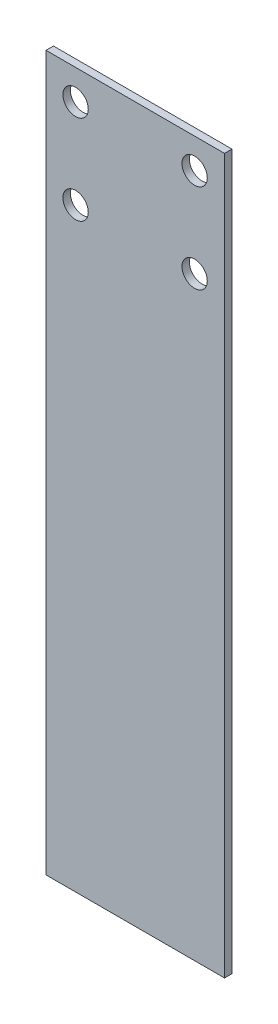
ISO-10303-21;
HEADER;
FILE_DESCRIPTION(('STEP AP214'),'2;1');
FILE_NAME('part.step','',(''),(''),'','','');
FILE_SCHEMA(('AUTOMOTIVE_DESIGN { 1 0 10303 214 1 1 1 1 }'));
ENDSEC;
DATA;
#1=APPLICATION_CONTEXT('core data for automotive mechanical design processes');
#2=APPLICATION_PROTOCOL_DEFINITION('international standard','automotive_design',2000,#1);
#3=PRODUCT_CONTEXT('',#1,'mechanical');
#4=PRODUCT('Part','Part','',(#3));
#5=PRODUCT_RELATED_PRODUCT_CATEGORY('part','',(#4));
#6=PRODUCT_DEFINITION_FORMATION('','',#4);
#7=PRODUCT_DEFINITION_CONTEXT('part definition',#1,'design');
#8=PRODUCT_DEFINITION('design','',#6,#7);
#9=PRODUCT_DEFINITION_SHAPE('','',#8);
#10=(LENGTH_UNIT() NAMED_UNIT(*) SI_UNIT(.MILLI.,.METRE.));
#11=(NAMED_UNIT(*) PLANE_ANGLE_UNIT() SI_UNIT($,.RADIAN.));
#12=(NAMED_UNIT(*) SI_UNIT($,.STERADIAN.) SOLID_ANGLE_UNIT());
#13=UNCERTAINTY_MEASURE_WITH_UNIT(LENGTH_MEASURE(1.E-05),#10,'distance_accuracy_value','');
#14=(GEOMETRIC_REPRESENTATION_CONTEXT(3) GLOBAL_UNCERTAINTY_ASSIGNED_CONTEXT((#13)) GLOBAL_UNIT_ASSIGNED_CONTEXT((#10,
#11,#12)) REPRESENTATION_CONTEXT('',''));
#15=CARTESIAN_POINT('',(0.,0.,0.));
#16=DIRECTION('',(0.,0.,1.));
#17=DIRECTION('',(1.,0.,0.));
#18=AXIS2_PLACEMENT_3D('',#15,#16,#17);
#19=CARTESIAN_POINT('',(-74.4140625,73.52109375,3.175));
#20=DIRECTION('',(1.,0.,0.));
#21=DIRECTION('',(0.,1.,0.));
#22=AXIS2_PLACEMENT_3D('',#19,#20,#21);
#23=PLANE('',#22);
#24=DIRECTION('',(0.,-1.,0.));
#25=VECTOR('',#24,1.);
#26=CARTESIAN_POINT('',(-74.4140625,73.52109375,0.));
#27=LINE('',#26,#25);
#28=CARTESIAN_POINT('',(-74.4140625,73.52109375,0.));
#29=VERTEX_POINT('',#28);
#30=CARTESIAN_POINT('',(-74.4140624999999,-231.27890625,0.));
#31=VERTEX_POINT('',#30);
#32=EDGE_CURVE('E107',#29,#31,#27,.T.);
#33=ORIENTED_EDGE('',*,*,#32,.T.);
#34=DIRECTION('',(0.,0.,-1.));
#35=VECTOR('',#34,1.);
#36=CARTESIAN_POINT('',(-74.4140624999999,-231.27890625,3.175));
#37=LINE('',#36,#35);
#38=CARTESIAN_POINT('',(-74.4140624999999,-231.27890625,3.175));
#39=VERTEX_POINT('',#38);
#40=EDGE_CURVE('E11',#39,#31,#37,.T.);
#41=ORIENTED_EDGE('',*,*,#40,.F.);
#42=DIRECTION('',(0.,-1.,0.));
#43=VECTOR('',#42,1.);
#44=CARTESIAN_POINT('',(-74.4140625,73.52109375,3.175));
#45=LINE('',#44,#43);
#46=CARTESIAN_POINT('',(-74.4140625,73.52109375,3.175));
#47=VERTEX_POINT('',#46);
#48=EDGE_CURVE('E91',#47,#39,#45,.T.);
#49=ORIENTED_EDGE('',*,*,#48,.F.);
#50=DIRECTION('',(0.,0.,-1.));
#51=VECTOR('',#50,1.);
#52=CARTESIAN_POINT('',(-74.4140625,73.52109375,3.175));
#53=LINE('',#52,#51);
#54=EDGE_CURVE('E103',#47,#29,#53,.T.);
#55=ORIENTED_EDGE('',*,*,#54,.T.);
#56=EDGE_LOOP('',(#33,#41,#49,#55));
#57=FACE_BOUND('',#56,.T.);
#58=ADVANCED_FACE('F39',(#57),#23,.F.);
#59=CARTESIAN_POINT('',(-74.4140624999999,-231.27890625,3.175));
#60=DIRECTION('',(0.,1.,0.));
#61=DIRECTION('',(0.,0.,1.));
#62=AXIS2_PLACEMENT_3D('',#59,#60,#61);
#63=PLANE('',#62);
#64=DIRECTION('',(1.,0.,0.));
#65=VECTOR('',#64,1.);
#66=CARTESIAN_POINT('',(-74.4140624999999,-231.27890625,0.));
#67=LINE('',#66,#65);
#68=CARTESIAN_POINT('',(1.78593750000004,-231.27890625,0.));
#69=VERTEX_POINT('',#68);
#70=EDGE_CURVE('E96',#31,#69,#67,.T.);
#71=ORIENTED_EDGE('',*,*,#70,.T.);
#72=DIRECTION('',(0.,0.,-1.));
#73=VECTOR('',#72,1.);
#74=CARTESIAN_POINT('',(1.78593750000004,-231.27890625,3.175));
#75=LINE('',#74,#73);
#76=CARTESIAN_POINT('',(1.78593750000004,-231.27890625,3.175));
#77=VERTEX_POINT('',#76);
#78=EDGE_CURVE('E48',#77,#69,#75,.T.);
#79=ORIENTED_EDGE('',*,*,#78,.F.);
#80=DIRECTION('',(1.,0.,0.));
#81=VECTOR('',#80,1.);
#82=CARTESIAN_POINT('',(-74.4140624999999,-231.27890625,3.175));
#83=LINE('',#82,#81);
#84=EDGE_CURVE('E86',#39,#77,#83,.T.);
#85=ORIENTED_EDGE('',*,*,#84,.F.);
#86=ORIENTED_EDGE('',*,*,#40,.T.);
#87=EDGE_LOOP('',(#71,#79,#85,#86));
#88=FACE_BOUND('',#87,.T.);
#89=ADVANCED_FACE('F95',(#88),#63,.F.);
#90=CARTESIAN_POINT('',(1.7859375,73.52109375,3.175));
#91=DIRECTION('',(-1.,0.,0.));
#92=DIRECTION('',(0.,-1.,0.));
#93=AXIS2_PLACEMENT_3D('',#90,#91,#92);
#94=PLANE('',#93);
#95=DIRECTION('',(0.,1.,0.));
#96=VECTOR('',#95,1.);
#97=CARTESIAN_POINT('',(1.7859375,73.52109375,0.));
#98=LINE('',#97,#96);
#99=CARTESIAN_POINT('',(1.7859375,73.52109375,0.));
#100=VERTEX_POINT('',#99);
#101=EDGE_CURVE('E73',#69,#100,#98,.T.);
#102=ORIENTED_EDGE('',*,*,#101,.T.);
#103=DIRECTION('',(0.,0.,-1.));
#104=VECTOR('',#103,1.);
#105=CARTESIAN_POINT('',(1.7859375,73.52109375,3.175));
#106=LINE('',#105,#104);
#107=CARTESIAN_POINT('',(1.7859375,73.52109375,3.175));
#108=VERTEX_POINT('',#107);
#109=EDGE_CURVE('E98',#108,#100,#106,.T.);
#110=ORIENTED_EDGE('',*,*,#109,.F.);
#111=DIRECTION('',(0.,1.,0.));
#112=VECTOR('',#111,1.);
#113=CARTESIAN_POINT('',(1.7859375,73.52109375,3.175));
#114=LINE('',#113,#112);
#115=EDGE_CURVE('E89',#77,#108,#114,.T.);
#116=ORIENTED_EDGE('',*,*,#115,.F.);
#117=ORIENTED_EDGE('',*,*,#78,.T.);
#118=EDGE_LOOP('',(#102,#110,#116,#117));
#119=FACE_BOUND('',#118,.T.);
#120=ADVANCED_FACE('F99',(#119),#94,.F.);
#121=CARTESIAN_POINT('',(-74.4140625,73.52109375,3.175));
#122=DIRECTION('',(0.,-1.,0.));
#123=DIRECTION('',(0.,0.,-1.));
#124=AXIS2_PLACEMENT_3D('',#121,#122,#123);
#125=PLANE('',#124);
#126=DIRECTION('',(-1.,0.,0.));
#127=VECTOR('',#126,1.);
#128=CARTESIAN_POINT('',(-74.4140625,73.52109375,0.));
#129=LINE('',#128,#127);
#130=EDGE_CURVE('E79',#100,#29,#129,.T.);
#131=ORIENTED_EDGE('',*,*,#130,.T.);
#132=ORIENTED_EDGE('',*,*,#54,.F.);
#133=DIRECTION('',(-1.,0.,0.));
#134=VECTOR('',#133,1.);
#135=CARTESIAN_POINT('',(-74.4140625,73.52109375,3.175));
#136=LINE('',#135,#134);
#137=EDGE_CURVE('E56',#108,#47,#136,.T.);
#138=ORIENTED_EDGE('',*,*,#137,.F.);
#139=ORIENTED_EDGE('',*,*,#109,.T.);
#140=EDGE_LOOP('',(#131,#132,#138,#139));
#141=FACE_BOUND('',#140,.T.);
#142=ADVANCED_FACE('F121',(#141),#125,.F.);
#143=CARTESIAN_POINT('',(0.,0.,3.175));
#144=DIRECTION('',(0.,0.,1.));
#145=DIRECTION('',(1.,0.,0.));
#146=AXIS2_PLACEMENT_3D('',#143,#144,#145);
#147=PLANE('',#146);
#148=CARTESIAN_POINT('',(-10.990440278763,60.7417293205692,3.175));
#149=DIRECTION('',(0.,0.,1.));
#150=DIRECTION('',(1.,0.,0.));
#151=AXIS2_PLACEMENT_3D('',#148,#149,#150);
#152=CIRCLE('',#151,5.40634871302378);
#153=CARTESIAN_POINT('',(-5.58409156573923,60.7417293205692,3.175));
#154=VERTEX_POINT('',#153);
#155=EDGE_CURVE('E136',#154,#154,#152,.T.);
#156=ORIENTED_EDGE('',*,*,#155,.F.);
#157=EDGE_LOOP('',(#156));
#158=FACE_BOUND('',#157,.T.);
#159=CARTESIAN_POINT('',(-61.790440278763,60.7417293205685,3.175));
#160=DIRECTION('',(0.,0.,1.));
#161=DIRECTION('',(1.,0.,0.));
#162=AXIS2_PLACEMENT_3D('',#159,#160,#161);
#163=CIRCLE('',#162,5.40634871302378);
#164=CARTESIAN_POINT('',(-56.3840915657392,60.7417293205685,3.175));
#165=VERTEX_POINT('',#164);
#166=EDGE_CURVE('E144',#165,#165,#163,.T.);
#167=ORIENTED_EDGE('',*,*,#166,.F.);
#168=EDGE_LOOP('',(#167));
#169=FACE_BOUND('',#168,.T.);
#170=CARTESIAN_POINT('',(-61.7904402787626,22.6417293205685,3.175));
#171=DIRECTION('',(0.,0.,1.));
#172=DIRECTION('',(1.,0.,0.));
#173=AXIS2_PLACEMENT_3D('',#170,#171,#172);
#174=CIRCLE('',#173,5.40634871302378);
#175=CARTESIAN_POINT('',(-56.3840915657388,22.6417293205685,3.175));
#176=VERTEX_POINT('',#175);
#177=EDGE_CURVE('E152',#176,#176,#174,.T.);
#178=ORIENTED_EDGE('',*,*,#177,.F.);
#179=EDGE_LOOP('',(#178));
#180=FACE_BOUND('',#179,.T.);
#181=CARTESIAN_POINT('',(-10.9904402787626,22.6417293205692,3.175));
#182=DIRECTION('',(0.,0.,1.));
#183=DIRECTION('',(1.,0.,0.));
#184=AXIS2_PLACEMENT_3D('',#181,#182,#183);
#185=CIRCLE('',#184,5.40634871302378);
#186=CARTESIAN_POINT('',(-5.58409156573884,22.6417293205692,3.175));
#187=VERTEX_POINT('',#186);
#188=EDGE_CURVE('E128',#187,#187,#185,.T.);
#189=ORIENTED_EDGE('',*,*,#188,.F.);
#190=EDGE_LOOP('',(#189));
#191=FACE_BOUND('',#190,.T.);
#192=ORIENTED_EDGE('',*,*,#48,.T.);
#193=ORIENTED_EDGE('',*,*,#84,.T.);
#194=ORIENTED_EDGE('',*,*,#115,.T.);
#195=ORIENTED_EDGE('',*,*,#137,.T.);
#196=EDGE_LOOP('',(#192,#193,#194,#195));
#197=FACE_BOUND('',#196,.T.);
#198=ADVANCED_FACE('F87',(#158,#169,#180,#191,#197),#147,.T.);
#199=CARTESIAN_POINT('',(0.,0.,0.));
#200=DIRECTION('',(0.,0.,1.));
#201=DIRECTION('',(1.,0.,0.));
#202=AXIS2_PLACEMENT_3D('',#199,#200,#201);
#203=PLANE('',#202);
#204=CARTESIAN_POINT('',(-10.990440278763,60.7417293205692,0.));
#205=DIRECTION('',(0.,0.,1.));
#206=DIRECTION('',(1.,0.,0.));
#207=AXIS2_PLACEMENT_3D('',#204,#205,#206);
#208=CIRCLE('',#207,5.40634871302378);
#209=CARTESIAN_POINT('',(-5.58409156573923,60.7417293205692,0.));
#210=VERTEX_POINT('',#209);
#211=EDGE_CURVE('E140',#210,#210,#208,.T.);
#212=ORIENTED_EDGE('',*,*,#211,.T.);
#213=EDGE_LOOP('',(#212));
#214=FACE_BOUND('',#213,.T.);
#215=CARTESIAN_POINT('',(-61.790440278763,60.7417293205685,0.));
#216=DIRECTION('',(0.,0.,1.));
#217=DIRECTION('',(1.,0.,0.));
#218=AXIS2_PLACEMENT_3D('',#215,#216,#217);
#219=CIRCLE('',#218,5.40634871302378);
#220=CARTESIAN_POINT('',(-56.3840915657392,60.7417293205685,0.));
#221=VERTEX_POINT('',#220);
#222=EDGE_CURVE('E148',#221,#221,#219,.T.);
#223=ORIENTED_EDGE('',*,*,#222,.T.);
#224=EDGE_LOOP('',(#223));
#225=FACE_BOUND('',#224,.T.);
#226=CARTESIAN_POINT('',(-61.7904402787626,22.6417293205685,0.));
#227=DIRECTION('',(0.,0.,1.));
#228=DIRECTION('',(1.,0.,0.));
#229=AXIS2_PLACEMENT_3D('',#226,#227,#228);
#230=CIRCLE('',#229,5.40634871302378);
#231=CARTESIAN_POINT('',(-56.3840915657388,22.6417293205685,0.));
#232=VERTEX_POINT('',#231);
#233=EDGE_CURVE('E132',#232,#232,#230,.T.);
#234=ORIENTED_EDGE('',*,*,#233,.T.);
#235=EDGE_LOOP('',(#234));
#236=FACE_BOUND('',#235,.T.);
#237=CARTESIAN_POINT('',(-10.9904402787626,22.6417293205692,0.));
#238=DIRECTION('',(0.,0.,1.));
#239=DIRECTION('',(1.,0.,0.));
#240=AXIS2_PLACEMENT_3D('',#237,#238,#239);
#241=CIRCLE('',#240,5.40634871302378);
#242=CARTESIAN_POINT('',(-5.58409156573884,22.6417293205692,0.));
#243=VERTEX_POINT('',#242);
#244=EDGE_CURVE('E111',#243,#243,#241,.T.);
#245=ORIENTED_EDGE('',*,*,#244,.T.);
#246=EDGE_LOOP('',(#245));
#247=FACE_BOUND('',#246,.T.);
#248=ORIENTED_EDGE('',*,*,#32,.F.);
#249=ORIENTED_EDGE('',*,*,#130,.F.);
#250=ORIENTED_EDGE('',*,*,#101,.F.);
#251=ORIENTED_EDGE('',*,*,#70,.F.);
#252=EDGE_LOOP('',(#248,#249,#250,#251));
#253=FACE_BOUND('',#252,.T.);
#254=ADVANCED_FACE('F124',(#214,#225,#236,#247,#253),#203,.F.);
#255=CARTESIAN_POINT('',(-10.9904402787626,22.6417293205692,0.));
#256=DIRECTION('',(0.,0.,1.));
#257=DIRECTION('',(1.,0.,0.));
#258=AXIS2_PLACEMENT_3D('',#255,#256,#257);
#259=CYLINDRICAL_SURFACE('',#258,5.40634871302378);
#260=ORIENTED_EDGE('',*,*,#244,.F.);
#261=EDGE_LOOP('',(#260));
#262=FACE_BOUND('',#261,.T.);
#263=ORIENTED_EDGE('',*,*,#188,.T.);
#264=EDGE_LOOP('',(#263));
#265=FACE_BOUND('',#264,.T.);
#266=ADVANCED_FACE('F166',(#262,#265),#259,.F.);
#267=CARTESIAN_POINT('',(-61.7904402787626,22.6417293205685,0.));
#268=DIRECTION('',(0.,0.,1.));
#269=DIRECTION('',(1.,0.,0.));
#270=AXIS2_PLACEMENT_3D('',#267,#268,#269);
#271=CYLINDRICAL_SURFACE('',#270,5.40634871302378);
#272=ORIENTED_EDGE('',*,*,#233,.F.);
#273=EDGE_LOOP('',(#272));
#274=FACE_BOUND('',#273,.T.);
#275=ORIENTED_EDGE('',*,*,#177,.T.);
#276=EDGE_LOOP('',(#275));
#277=FACE_BOUND('',#276,.T.);
#278=ADVANCED_FACE('F162',(#274,#277),#271,.F.);
#279=CARTESIAN_POINT('',(-61.790440278763,60.7417293205685,0.));
#280=DIRECTION('',(0.,0.,1.));
#281=DIRECTION('',(1.,0.,0.));
#282=AXIS2_PLACEMENT_3D('',#279,#280,#281);
#283=CYLINDRICAL_SURFACE('',#282,5.40634871302378);
#284=ORIENTED_EDGE('',*,*,#222,.F.);
#285=EDGE_LOOP('',(#284));
#286=FACE_BOUND('',#285,.T.);
#287=ORIENTED_EDGE('',*,*,#166,.T.);
#288=EDGE_LOOP('',(#287));
#289=FACE_BOUND('',#288,.T.);
#290=ADVANCED_FACE('F165',(#286,#289),#283,.F.);
#291=CARTESIAN_POINT('',(-10.990440278763,60.7417293205692,0.));
#292=DIRECTION('',(0.,0.,1.));
#293=DIRECTION('',(1.,0.,0.));
#294=AXIS2_PLACEMENT_3D('',#291,#292,#293);
#295=CYLINDRICAL_SURFACE('',#294,5.40634871302378);
#296=ORIENTED_EDGE('',*,*,#211,.F.);
#297=EDGE_LOOP('',(#296));
#298=FACE_BOUND('',#297,.T.);
#299=ORIENTED_EDGE('',*,*,#155,.T.);
#300=EDGE_LOOP('',(#299));
#301=FACE_BOUND('',#300,.T.);
#302=ADVANCED_FACE('F227',(#298,#301),#295,.F.);
#303=CLOSED_SHELL('',(#58,#89,#120,#142,#198,#254,#266,#278,#290,#302));
#304=MANIFOLD_SOLID_BREP('B2',#303);
#305=ADVANCED_BREP_SHAPE_REPRESENTATION('',(#18,#304),#14);
#306=SHAPE_DEFINITION_REPRESENTATION(#9,#305);
ENDSEC;
END-ISO-10303-21;
